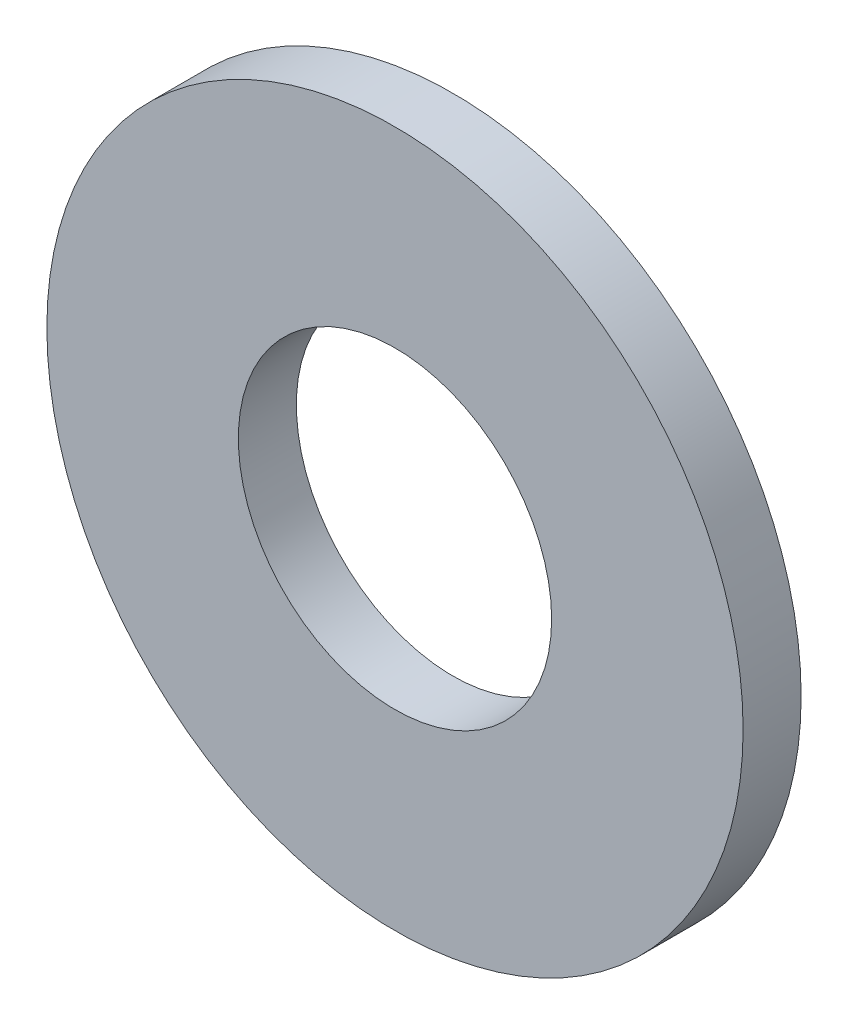
ISO-10303-21;
HEADER;
FILE_DESCRIPTION(('STEP AP214'),'2;1');
FILE_NAME('part.step','',(''),(''),'','','');
FILE_SCHEMA(('AUTOMOTIVE_DESIGN { 1 0 10303 214 1 1 1 1 }'));
ENDSEC;
DATA;
#1=APPLICATION_CONTEXT('core data for automotive mechanical design processes');
#2=APPLICATION_PROTOCOL_DEFINITION('international standard','automotive_design',2000,#1);
#3=PRODUCT_CONTEXT('',#1,'mechanical');
#4=PRODUCT('Part','Part','',(#3));
#5=PRODUCT_RELATED_PRODUCT_CATEGORY('part','',(#4));
#6=PRODUCT_DEFINITION_FORMATION('','',#4);
#7=PRODUCT_DEFINITION_CONTEXT('part definition',#1,'design');
#8=PRODUCT_DEFINITION('design','',#6,#7);
#9=PRODUCT_DEFINITION_SHAPE('','',#8);
#10=(LENGTH_UNIT() NAMED_UNIT(*) SI_UNIT(.MILLI.,.METRE.));
#11=(NAMED_UNIT(*) PLANE_ANGLE_UNIT() SI_UNIT($,.RADIAN.));
#12=(NAMED_UNIT(*) SI_UNIT($,.STERADIAN.) SOLID_ANGLE_UNIT());
#13=UNCERTAINTY_MEASURE_WITH_UNIT(LENGTH_MEASURE(1.E-05),#10,'distance_accuracy_value','');
#14=(GEOMETRIC_REPRESENTATION_CONTEXT(3) GLOBAL_UNCERTAINTY_ASSIGNED_CONTEXT((#13)) GLOBAL_UNIT_ASSIGNED_CONTEXT((#10,
#11,#12)) REPRESENTATION_CONTEXT('',''));
#15=CARTESIAN_POINT('',(0.,0.,0.));
#16=DIRECTION('',(0.,0.,1.));
#17=DIRECTION('',(1.,0.,0.));
#18=AXIS2_PLACEMENT_3D('',#15,#16,#17);
#19=CARTESIAN_POINT('',(1.35,0.,0.5));
#20=DIRECTION('',(0.,0.,1.));
#21=DIRECTION('',(1.,0.,0.));
#22=AXIS2_PLACEMENT_3D('',#19,#20,#21);
#23=PLANE('',#22);
#24=CARTESIAN_POINT('',(0.,0.,0.5));
#25=DIRECTION('',(0.,0.,1.));
#26=DIRECTION('',(1.,0.,0.));
#27=AXIS2_PLACEMENT_3D('',#24,#25,#26);
#28=CIRCLE('',#27,3.);
#29=CARTESIAN_POINT('',(3.,0.,0.5));
#30=VERTEX_POINT('',#29);
#31=EDGE_CURVE('E10',#30,#30,#28,.T.);
#32=ORIENTED_EDGE('',*,*,#31,.T.);
#33=EDGE_LOOP('',(#32));
#34=FACE_BOUND('',#33,.T.);
#35=CARTESIAN_POINT('',(0.,0.,0.5));
#36=DIRECTION('',(0.,0.,1.));
#37=DIRECTION('',(1.,0.,0.));
#38=AXIS2_PLACEMENT_3D('',#35,#36,#37);
#39=CIRCLE('',#38,1.35);
#40=CARTESIAN_POINT('',(1.35,0.,0.5));
#41=VERTEX_POINT('',#40);
#42=EDGE_CURVE('E47',#41,#41,#39,.T.);
#43=ORIENTED_EDGE('',*,*,#42,.F.);
#44=EDGE_LOOP('',(#43));
#45=FACE_BOUND('',#44,.T.);
#46=ADVANCED_FACE('F33',(#34,#45),#23,.T.);
#47=CARTESIAN_POINT('',(0.,0.,0.));
#48=DIRECTION('',(0.,0.,1.));
#49=DIRECTION('',(1.,0.,0.));
#50=AXIS2_PLACEMENT_3D('',#47,#48,#49);
#51=CYLINDRICAL_SURFACE('',#50,3.);
#52=CARTESIAN_POINT('',(0.,0.,0.));
#53=DIRECTION('',(0.,0.,1.));
#54=DIRECTION('',(1.,0.,0.));
#55=AXIS2_PLACEMENT_3D('',#52,#53,#54);
#56=CIRCLE('',#55,3.);
#57=CARTESIAN_POINT('',(3.,0.,0.));
#58=VERTEX_POINT('',#57);
#59=EDGE_CURVE('E39',#58,#58,#56,.T.);
#60=ORIENTED_EDGE('',*,*,#59,.T.);
#61=EDGE_LOOP('',(#60));
#62=FACE_BOUND('',#61,.T.);
#63=ORIENTED_EDGE('',*,*,#31,.F.);
#64=EDGE_LOOP('',(#63));
#65=FACE_BOUND('',#64,.T.);
#66=ADVANCED_FACE('F57',(#62,#65),#51,.T.);
#67=CARTESIAN_POINT('',(3.,0.,0.));
#68=DIRECTION('',(0.,0.,-1.));
#69=DIRECTION('',(-1.,0.,0.));
#70=AXIS2_PLACEMENT_3D('',#67,#68,#69);
#71=PLANE('',#70);
#72=CARTESIAN_POINT('',(0.,0.,0.));
#73=DIRECTION('',(0.,0.,1.));
#74=DIRECTION('',(1.,0.,0.));
#75=AXIS2_PLACEMENT_3D('',#72,#73,#74);
#76=CIRCLE('',#75,1.35);
#77=CARTESIAN_POINT('',(1.35,0.,0.));
#78=VERTEX_POINT('',#77);
#79=EDGE_CURVE('E43',#78,#78,#76,.T.);
#80=ORIENTED_EDGE('',*,*,#79,.T.);
#81=EDGE_LOOP('',(#80));
#82=FACE_BOUND('',#81,.T.);
#83=ORIENTED_EDGE('',*,*,#59,.F.);
#84=EDGE_LOOP('',(#83));
#85=FACE_BOUND('',#84,.T.);
#86=ADVANCED_FACE('F61',(#82,#85),#71,.T.);
#87=CARTESIAN_POINT('',(0.,0.,0.));
#88=DIRECTION('',(0.,0.,1.));
#89=DIRECTION('',(1.,0.,0.));
#90=AXIS2_PLACEMENT_3D('',#87,#88,#89);
#91=CYLINDRICAL_SURFACE('',#90,1.35);
#92=ORIENTED_EDGE('',*,*,#42,.T.);
#93=EDGE_LOOP('',(#92));
#94=FACE_BOUND('',#93,.T.);
#95=ORIENTED_EDGE('',*,*,#79,.F.);
#96=EDGE_LOOP('',(#95));
#97=FACE_BOUND('',#96,.T.);
#98=ADVANCED_FACE('F53',(#94,#97),#91,.F.);
#99=CLOSED_SHELL('',(#46,#66,#86,#98));
#100=MANIFOLD_SOLID_BREP('B2',#99);
#101=ADVANCED_BREP_SHAPE_REPRESENTATION('',(#18,#100),#14);
#102=SHAPE_DEFINITION_REPRESENTATION(#9,#101);
ENDSEC;
END-ISO-10303-21;
